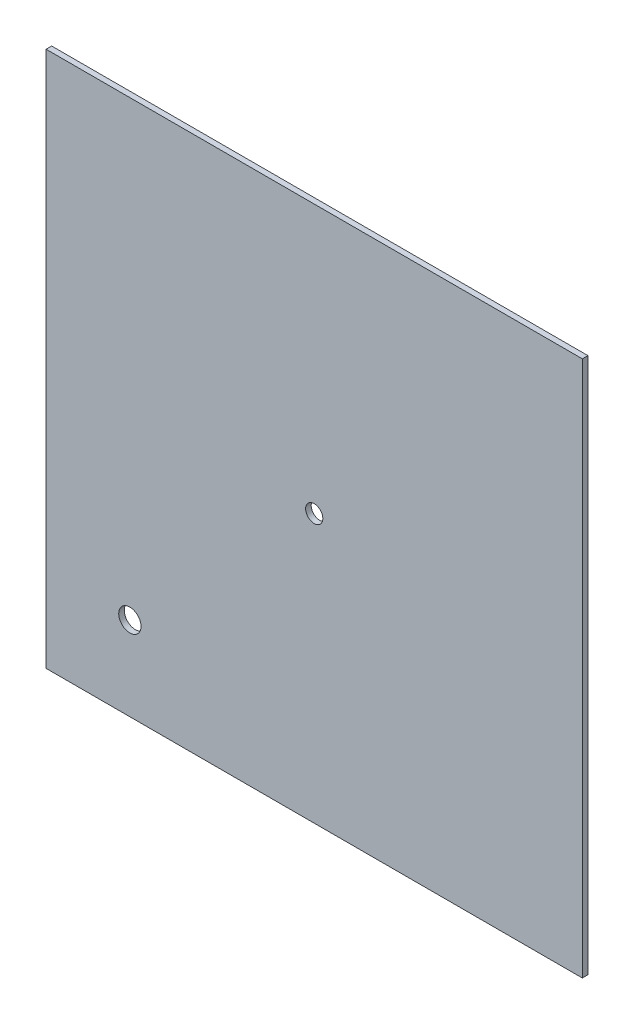
ISO-10303-21;
HEADER;
FILE_DESCRIPTION(('STEP AP214'),'2;1');
FILE_NAME('part.step','',(''),(''),'','','');
FILE_SCHEMA(('AUTOMOTIVE_DESIGN { 1 0 10303 214 1 1 1 1 }'));
ENDSEC;
DATA;
#1=APPLICATION_CONTEXT('core data for automotive mechanical design processes');
#2=APPLICATION_PROTOCOL_DEFINITION('international standard','automotive_design',2000,#1);
#3=PRODUCT_CONTEXT('',#1,'mechanical');
#4=PRODUCT('Part','Part','',(#3));
#5=PRODUCT_RELATED_PRODUCT_CATEGORY('part','',(#4));
#6=PRODUCT_DEFINITION_FORMATION('','',#4);
#7=PRODUCT_DEFINITION_CONTEXT('part definition',#1,'design');
#8=PRODUCT_DEFINITION('design','',#6,#7);
#9=PRODUCT_DEFINITION_SHAPE('','',#8);
#10=(LENGTH_UNIT() NAMED_UNIT(*) SI_UNIT(.MILLI.,.METRE.));
#11=(NAMED_UNIT(*) PLANE_ANGLE_UNIT() SI_UNIT($,.RADIAN.));
#12=(NAMED_UNIT(*) SI_UNIT($,.STERADIAN.) SOLID_ANGLE_UNIT());
#13=UNCERTAINTY_MEASURE_WITH_UNIT(LENGTH_MEASURE(1.E-05),#10,'distance_accuracy_value','');
#14=(GEOMETRIC_REPRESENTATION_CONTEXT(3) GLOBAL_UNCERTAINTY_ASSIGNED_CONTEXT((#13)) GLOBAL_UNIT_ASSIGNED_CONTEXT((#10,
#11,#12)) REPRESENTATION_CONTEXT('',''));
#15=CARTESIAN_POINT('',(0.,0.,0.));
#16=DIRECTION('',(0.,0.,1.));
#17=DIRECTION('',(1.,0.,0.));
#18=AXIS2_PLACEMENT_3D('',#15,#16,#17);
#19=CARTESIAN_POINT('',(152.4,152.4,3.175));
#20=DIRECTION('',(0.,0.,-1.));
#21=DIRECTION('',(-1.,0.,0.));
#22=AXIS2_PLACEMENT_3D('',#19,#20,#21);
#23=PLANE('',#22);
#24=CARTESIAN_POINT('',(-104.775,-104.775,3.175));
#25=DIRECTION('',(0.,0.,-1.));
#26=DIRECTION('',(-1.,0.,0.));
#27=AXIS2_PLACEMENT_3D('',#24,#25,#26);
#28=CIRCLE('',#27,6.34999999999999);
#29=CARTESIAN_POINT('',(-111.125,-104.775,3.175));
#30=VERTEX_POINT('',#29);
#31=EDGE_CURVE('E113',#30,#30,#28,.T.);
#32=ORIENTED_EDGE('',*,*,#31,.T.);
#33=EDGE_LOOP('',(#32));
#34=FACE_BOUND('',#33,.T.);
#35=DIRECTION('',(0.,1.,0.));
#36=VECTOR('',#35,1.);
#37=CARTESIAN_POINT('',(152.4,-152.4,3.175));
#38=LINE('',#37,#36);
#39=CARTESIAN_POINT('',(152.4,-152.4,3.175));
#40=VERTEX_POINT('',#39);
#41=CARTESIAN_POINT('',(152.4,152.4,3.175));
#42=VERTEX_POINT('',#41);
#43=EDGE_CURVE('E83',#40,#42,#38,.T.);
#44=ORIENTED_EDGE('',*,*,#43,.T.);
#45=DIRECTION('',(-1.,0.,0.));
#46=VECTOR('',#45,1.);
#47=CARTESIAN_POINT('',(-152.4,152.4,3.175));
#48=LINE('',#47,#46);
#49=CARTESIAN_POINT('',(-152.4,152.4,3.175));
#50=VERTEX_POINT('',#49);
#51=EDGE_CURVE('E78',#42,#50,#48,.T.);
#52=ORIENTED_EDGE('',*,*,#51,.T.);
#53=DIRECTION('',(0.,-1.,0.));
#54=VECTOR('',#53,1.);
#55=CARTESIAN_POINT('',(-152.4,-152.4,3.175));
#56=LINE('',#55,#54);
#57=CARTESIAN_POINT('',(-152.4,-152.4,3.175));
#58=VERTEX_POINT('',#57);
#59=EDGE_CURVE('E81',#50,#58,#56,.T.);
#60=ORIENTED_EDGE('',*,*,#59,.T.);
#61=DIRECTION('',(1.,0.,0.));
#62=VECTOR('',#61,1.);
#63=CARTESIAN_POINT('',(-152.4,-152.4,3.175));
#64=LINE('',#63,#62);
#65=EDGE_CURVE('E48',#58,#40,#64,.T.);
#66=ORIENTED_EDGE('',*,*,#65,.T.);
#67=EDGE_LOOP('',(#44,#52,#60,#66));
#68=FACE_BOUND('',#67,.T.);
#69=CARTESIAN_POINT('',(0.,0.,3.175));
#70=DIRECTION('',(0.,0.,1.));
#71=DIRECTION('',(1.,0.,0.));
#72=AXIS2_PLACEMENT_3D('',#69,#70,#71);
#73=CIRCLE('',#72,4.8895);
#74=CARTESIAN_POINT('',(4.88949999999992,0.,3.175));
#75=VERTEX_POINT('',#74);
#76=EDGE_CURVE('E98',#75,#75,#73,.T.);
#77=ORIENTED_EDGE('',*,*,#76,.F.);
#78=EDGE_LOOP('',(#77));
#79=FACE_BOUND('',#78,.T.);
#80=ADVANCED_FACE('F31',(#34,#68,#79),#23,.F.);
#81=CARTESIAN_POINT('',(152.4,152.4,0.));
#82=DIRECTION('',(0.,0.,-1.));
#83=DIRECTION('',(-1.,0.,0.));
#84=AXIS2_PLACEMENT_3D('',#81,#82,#83);
#85=PLANE('',#84);
#86=CARTESIAN_POINT('',(-104.775,-104.775,0.));
#87=DIRECTION('',(0.,0.,-1.));
#88=DIRECTION('',(-1.,0.,0.));
#89=AXIS2_PLACEMENT_3D('',#86,#87,#88);
#90=CIRCLE('',#89,6.34999999999999);
#91=CARTESIAN_POINT('',(-111.125,-104.775,0.));
#92=VERTEX_POINT('',#91);
#93=EDGE_CURVE('E118',#92,#92,#90,.T.);
#94=ORIENTED_EDGE('',*,*,#93,.F.);
#95=EDGE_LOOP('',(#94));
#96=FACE_BOUND('',#95,.T.);
#97=DIRECTION('',(0.,1.,0.));
#98=VECTOR('',#97,1.);
#99=CARTESIAN_POINT('',(152.4,-152.4,0.));
#100=LINE('',#99,#98);
#101=CARTESIAN_POINT('',(152.4,-152.4,0.));
#102=VERTEX_POINT('',#101);
#103=CARTESIAN_POINT('',(152.4,152.4,0.));
#104=VERTEX_POINT('',#103);
#105=EDGE_CURVE('E95',#102,#104,#100,.T.);
#106=ORIENTED_EDGE('',*,*,#105,.F.);
#107=DIRECTION('',(1.,0.,0.));
#108=VECTOR('',#107,1.);
#109=CARTESIAN_POINT('',(-152.4,-152.4,0.));
#110=LINE('',#109,#108);
#111=CARTESIAN_POINT('',(-152.4,-152.4,0.));
#112=VERTEX_POINT('',#111);
#113=EDGE_CURVE('E71',#112,#102,#110,.T.);
#114=ORIENTED_EDGE('',*,*,#113,.F.);
#115=DIRECTION('',(0.,-1.,0.));
#116=VECTOR('',#115,1.);
#117=CARTESIAN_POINT('',(-152.4,-152.4,0.));
#118=LINE('',#117,#116);
#119=CARTESIAN_POINT('',(-152.4,152.4,0.));
#120=VERTEX_POINT('',#119);
#121=EDGE_CURVE('E65',#120,#112,#118,.T.);
#122=ORIENTED_EDGE('',*,*,#121,.F.);
#123=DIRECTION('',(-1.,0.,0.));
#124=VECTOR('',#123,1.);
#125=CARTESIAN_POINT('',(-152.4,152.4,0.));
#126=LINE('',#125,#124);
#127=EDGE_CURVE('E87',#104,#120,#126,.T.);
#128=ORIENTED_EDGE('',*,*,#127,.F.);
#129=EDGE_LOOP('',(#106,#114,#122,#128));
#130=FACE_BOUND('',#129,.T.);
#131=CARTESIAN_POINT('',(0.,0.,0.));
#132=DIRECTION('',(0.,0.,1.));
#133=DIRECTION('',(1.,0.,0.));
#134=AXIS2_PLACEMENT_3D('',#131,#132,#133);
#135=CIRCLE('',#134,4.8895);
#136=CARTESIAN_POINT('',(4.88949999999992,0.,0.));
#137=VERTEX_POINT('',#136);
#138=EDGE_CURVE('E110',#137,#137,#135,.T.);
#139=ORIENTED_EDGE('',*,*,#138,.T.);
#140=EDGE_LOOP('',(#139));
#141=FACE_BOUND('',#140,.T.);
#142=ADVANCED_FACE('F106',(#96,#130,#141),#85,.T.);
#143=CARTESIAN_POINT('',(152.4,-152.4,3.175));
#144=DIRECTION('',(-1.,0.,0.));
#145=DIRECTION('',(0.,0.,1.));
#146=AXIS2_PLACEMENT_3D('',#143,#144,#145);
#147=PLANE('',#146);
#148=ORIENTED_EDGE('',*,*,#105,.T.);
#149=DIRECTION('',(0.,0.,-1.));
#150=VECTOR('',#149,1.);
#151=CARTESIAN_POINT('',(152.4,152.4,3.175));
#152=LINE('',#151,#150);
#153=EDGE_CURVE('E11',#42,#104,#152,.T.);
#154=ORIENTED_EDGE('',*,*,#153,.F.);
#155=ORIENTED_EDGE('',*,*,#43,.F.);
#156=DIRECTION('',(0.,0.,-1.));
#157=VECTOR('',#156,1.);
#158=CARTESIAN_POINT('',(152.4,-152.4,3.175));
#159=LINE('',#158,#157);
#160=EDGE_CURVE('E91',#40,#102,#159,.T.);
#161=ORIENTED_EDGE('',*,*,#160,.T.);
#162=EDGE_LOOP('',(#148,#154,#155,#161));
#163=FACE_BOUND('',#162,.T.);
#164=ADVANCED_FACE('F33',(#163),#147,.F.);
#165=CARTESIAN_POINT('',(-152.4,152.4,3.175));
#166=DIRECTION('',(0.,-1.,0.));
#167=DIRECTION('',(0.,0.,-1.));
#168=AXIS2_PLACEMENT_3D('',#165,#166,#167);
#169=PLANE('',#168);
#170=ORIENTED_EDGE('',*,*,#127,.T.);
#171=DIRECTION('',(0.,0.,-1.));
#172=VECTOR('',#171,1.);
#173=CARTESIAN_POINT('',(-152.4,152.4,3.175));
#174=LINE('',#173,#172);
#175=EDGE_CURVE('E40',#50,#120,#174,.T.);
#176=ORIENTED_EDGE('',*,*,#175,.F.);
#177=ORIENTED_EDGE('',*,*,#51,.F.);
#178=ORIENTED_EDGE('',*,*,#153,.T.);
#179=EDGE_LOOP('',(#170,#176,#177,#178));
#180=FACE_BOUND('',#179,.T.);
#181=ADVANCED_FACE('F86',(#180),#169,.F.);
#182=CARTESIAN_POINT('',(-152.4,-152.4,3.175));
#183=DIRECTION('',(1.,0.,0.));
#184=DIRECTION('',(0.,0.,-1.));
#185=AXIS2_PLACEMENT_3D('',#182,#183,#184);
#186=PLANE('',#185);
#187=ORIENTED_EDGE('',*,*,#121,.T.);
#188=DIRECTION('',(0.,0.,-1.));
#189=VECTOR('',#188,1.);
#190=CARTESIAN_POINT('',(-152.4,-152.4,3.175));
#191=LINE('',#190,#189);
#192=EDGE_CURVE('E88',#58,#112,#191,.T.);
#193=ORIENTED_EDGE('',*,*,#192,.F.);
#194=ORIENTED_EDGE('',*,*,#59,.F.);
#195=ORIENTED_EDGE('',*,*,#175,.T.);
#196=EDGE_LOOP('',(#187,#193,#194,#195));
#197=FACE_BOUND('',#196,.T.);
#198=ADVANCED_FACE('F89',(#197),#186,.F.);
#199=CARTESIAN_POINT('',(-152.4,-152.4,3.175));
#200=DIRECTION('',(0.,1.,0.));
#201=DIRECTION('',(0.,0.,1.));
#202=AXIS2_PLACEMENT_3D('',#199,#200,#201);
#203=PLANE('',#202);
#204=ORIENTED_EDGE('',*,*,#113,.T.);
#205=ORIENTED_EDGE('',*,*,#160,.F.);
#206=ORIENTED_EDGE('',*,*,#65,.F.);
#207=ORIENTED_EDGE('',*,*,#192,.T.);
#208=EDGE_LOOP('',(#204,#205,#206,#207));
#209=FACE_BOUND('',#208,.T.);
#210=ADVANCED_FACE('F103',(#209),#203,.F.);
#211=CARTESIAN_POINT('',(0.,0.,3.175));
#212=DIRECTION('',(0.,0.,-1.));
#213=DIRECTION('',(-1.,0.,0.));
#214=AXIS2_PLACEMENT_3D('',#211,#212,#213);
#215=CYLINDRICAL_SURFACE('',#214,4.8895);
#216=ORIENTED_EDGE('',*,*,#76,.T.);
#217=EDGE_LOOP('',(#216));
#218=FACE_BOUND('',#217,.T.);
#219=ORIENTED_EDGE('',*,*,#138,.F.);
#220=EDGE_LOOP('',(#219));
#221=FACE_BOUND('',#220,.T.);
#222=ADVANCED_FACE('F138',(#218,#221),#215,.F.);
#223=CARTESIAN_POINT('',(-104.775,-104.775,7.62));
#224=DIRECTION('',(0.,0.,-1.));
#225=DIRECTION('',(-1.,0.,0.));
#226=AXIS2_PLACEMENT_3D('',#223,#224,#225);
#227=CYLINDRICAL_SURFACE('',#226,6.34999999999999);
#228=ORIENTED_EDGE('',*,*,#93,.T.);
#229=EDGE_LOOP('',(#228));
#230=FACE_BOUND('',#229,.T.);
#231=ORIENTED_EDGE('',*,*,#31,.F.);
#232=EDGE_LOOP('',(#231));
#233=FACE_BOUND('',#232,.T.);
#234=ADVANCED_FACE('F122',(#230,#233),#227,.F.);
#235=CLOSED_SHELL('',(#80,#142,#164,#181,#198,#210,#222,#234));
#236=MANIFOLD_SOLID_BREP('B2',#235);
#237=ADVANCED_BREP_SHAPE_REPRESENTATION('',(#18,#236),#14);
#238=SHAPE_DEFINITION_REPRESENTATION(#9,#237);
ENDSEC;
END-ISO-10303-21;
